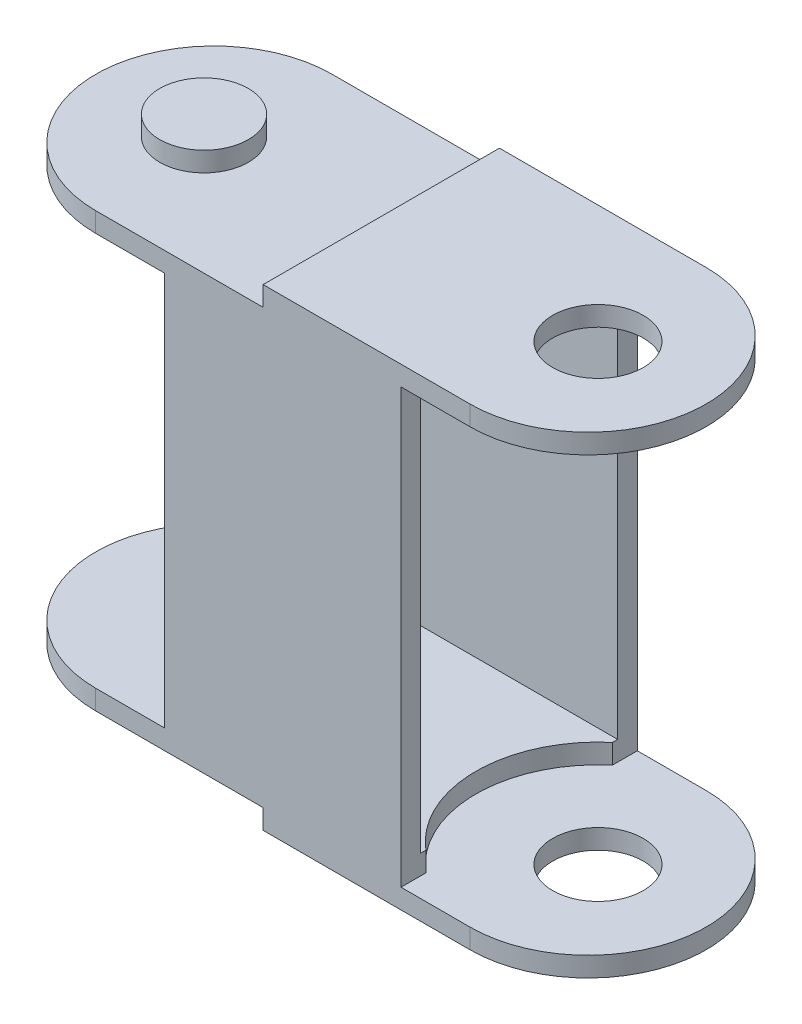
ISO-10303-21;
HEADER;
FILE_DESCRIPTION(('STEP AP214'),'2;1');
FILE_NAME('part.step','',(''),(''),'','','');
FILE_SCHEMA(('AUTOMOTIVE_DESIGN { 1 0 10303 214 1 1 1 1 }'));
ENDSEC;
DATA;
#1=APPLICATION_CONTEXT('core data for automotive mechanical design processes');
#2=APPLICATION_PROTOCOL_DEFINITION('international standard','automotive_design',2000,#1);
#3=PRODUCT_CONTEXT('',#1,'mechanical');
#4=PRODUCT('Part','Part','',(#3));
#5=PRODUCT_RELATED_PRODUCT_CATEGORY('part','',(#4));
#6=PRODUCT_DEFINITION_FORMATION('','',#4);
#7=PRODUCT_DEFINITION_CONTEXT('part definition',#1,'design');
#8=PRODUCT_DEFINITION('design','',#6,#7);
#9=PRODUCT_DEFINITION_SHAPE('','',#8);
#10=(LENGTH_UNIT() NAMED_UNIT(*) SI_UNIT(.MILLI.,.METRE.));
#11=(NAMED_UNIT(*) PLANE_ANGLE_UNIT() SI_UNIT($,.RADIAN.));
#12=(NAMED_UNIT(*) SI_UNIT($,.STERADIAN.) SOLID_ANGLE_UNIT());
#13=UNCERTAINTY_MEASURE_WITH_UNIT(LENGTH_MEASURE(1.E-05),#10,'distance_accuracy_value','');
#14=(GEOMETRIC_REPRESENTATION_CONTEXT(3) GLOBAL_UNCERTAINTY_ASSIGNED_CONTEXT((#13)) GLOBAL_UNIT_ASSIGNED_CONTEXT((#10,
#11,#12)) REPRESENTATION_CONTEXT('',''));
#15=CARTESIAN_POINT('',(0.,0.,0.));
#16=DIRECTION('',(0.,0.,1.));
#17=DIRECTION('',(1.,0.,0.));
#18=AXIS2_PLACEMENT_3D('',#15,#16,#17);
#19=CARTESIAN_POINT('',(-520.,21.5,0.));
#20=DIRECTION('',(0.,1.,0.));
#21=DIRECTION('',(-1.,0.,0.));
#22=AXIS2_PLACEMENT_3D('',#19,#20,#21);
#23=CYLINDRICAL_SURFACE('',#22,2.25);
#24=CARTESIAN_POINT('',(-520.,21.,0.));
#25=DIRECTION('',(0.,1.,0.));
#26=DIRECTION('',(-1.,0.,0.));
#27=AXIS2_PLACEMENT_3D('',#24,#25,#26);
#28=CIRCLE('',#27,2.25);
#29=CARTESIAN_POINT('',(-522.25,21.,0.));
#30=VERTEX_POINT('',#29);
#31=EDGE_CURVE('E205',#30,#30,#28,.F.);
#32=ORIENTED_EDGE('',*,*,#31,.F.);
#33=EDGE_LOOP('',(#32));
#34=FACE_BOUND('',#33,.T.);
#35=CARTESIAN_POINT('',(-520.,22.,0.));
#36=DIRECTION('',(0.,-1.,0.));
#37=DIRECTION('',(1.,0.,0.));
#38=AXIS2_PLACEMENT_3D('',#35,#36,#37);
#39=CIRCLE('',#38,2.25);
#40=CARTESIAN_POINT('',(-517.75,22.,0.));
#41=VERTEX_POINT('',#40);
#42=EDGE_CURVE('E202',#41,#41,#39,.F.);
#43=ORIENTED_EDGE('',*,*,#42,.F.);
#44=EDGE_LOOP('',(#43));
#45=FACE_BOUND('',#44,.T.);
#46=ADVANCED_FACE('F17',(#34,#45),#23,.T.);
#47=CARTESIAN_POINT('',(-511.,21.,6.));
#48=DIRECTION('',(0.,1.,0.));
#49=DIRECTION('',(0.,0.,-1.));
#50=AXIS2_PLACEMENT_3D('',#47,#48,#49);
#51=PLANE('',#50);
#52=CARTESIAN_POINT('',(-519.4999999999,21.,-1.E-10));
#53=DIRECTION('',(0.,1.,0.));
#54=DIRECTION('',(-1.,0.,1.6666E-11));
#55=AXIS2_PLACEMENT_3D('',#52,#53,#54);
#56=CIRCLE('',#55,6.);
#57=CARTESIAN_POINT('',(-519.499999999925,21.,5.9999999999));
#58=VERTEX_POINT('',#57);
#59=CARTESIAN_POINT('',(-519.499999999904,21.,-5.999999999986));
#60=VERTEX_POINT('',#59);
#61=EDGE_CURVE('E189',#58,#60,#56,.F.);
#62=ORIENTED_EDGE('',*,*,#61,.F.);
#63=DIRECTION('',(1.,0.,1.0458E-11));
#64=VECTOR('',#63,1.);
#65=CARTESIAN_POINT('',(-519.499999999925,21.,5.999999999911));
#66=LINE('',#65,#64);
#67=CARTESIAN_POINT('',(-511.,21.,6.));
#68=VERTEX_POINT('',#67);
#69=EDGE_CURVE('E177',#68,#58,#66,.F.);
#70=ORIENTED_EDGE('',*,*,#69,.F.);
#71=DIRECTION('',(0.,0.,-1.));
#72=VECTOR('',#71,1.);
#73=CARTESIAN_POINT('',(-511.,21.,6.));
#74=LINE('',#73,#72);
#75=CARTESIAN_POINT('',(-511.,21.,-6.));
#76=VERTEX_POINT('',#75);
#77=EDGE_CURVE('E188',#76,#68,#74,.F.);
#78=ORIENTED_EDGE('',*,*,#77,.F.);
#79=DIRECTION('',(-1.,0.,1.63E-12));
#80=VECTOR('',#79,1.);
#81=CARTESIAN_POINT('',(-511.,21.,-6.));
#82=LINE('',#81,#80);
#83=EDGE_CURVE('E201',#60,#76,#82,.F.);
#84=ORIENTED_EDGE('',*,*,#83,.F.);
#85=EDGE_LOOP('',(#62,#70,#78,#84));
#86=FACE_BOUND('',#85,.T.);
#87=ORIENTED_EDGE('',*,*,#31,.T.);
#88=EDGE_LOOP('',(#87));
#89=FACE_BOUND('',#88,.T.);
#90=ADVANCED_FACE('F199',(#86,#89),#51,.T.);
#91=CARTESIAN_POINT('',(-517.75,22.,-2.310200434237));
#92=DIRECTION('',(0.,1.,0.));
#93=DIRECTION('',(-1.,0.,0.));
#94=AXIS2_PLACEMENT_3D('',#91,#92,#93);
#95=PLANE('',#94);
#96=ORIENTED_EDGE('',*,*,#42,.T.);
#97=EDGE_LOOP('',(#96));
#98=FACE_BOUND('',#97,.T.);
#99=ADVANCED_FACE('F629',(#98),#95,.T.);
#100=CARTESIAN_POINT('',(-519.4999999999,-2.,1.E-10));
#101=DIRECTION('',(0.,1.,0.));
#102=DIRECTION('',(0.,0.,-1.));
#103=AXIS2_PLACEMENT_3D('',#100,#101,#102);
#104=CYLINDRICAL_SURFACE('',#103,6.);
#105=DIRECTION('',(-2.0691E-11,-1.,0.));
#106=VECTOR('',#105,1.);
#107=CARTESIAN_POINT('',(-519.499999999904,21.,-5.9999999999));
#108=LINE('',#107,#106);
#109=CARTESIAN_POINT('',(-519.499999999925,20.,-5.9999999999));
#110=VERTEX_POINT('',#109);
#111=EDGE_CURVE('E217',#110,#60,#108,.F.);
#112=ORIENTED_EDGE('',*,*,#111,.F.);
#113=CARTESIAN_POINT('',(-519.4999999999,20.,1.E-10));
#114=DIRECTION('',(0.,1.,0.));
#115=DIRECTION('',(-4.169E-12,0.,-1.));
#116=AXIS2_PLACEMENT_3D('',#113,#114,#115);
#117=CIRCLE('',#116,6.);
#118=CARTESIAN_POINT('',(-519.499999999909,20.,5.9999999999));
#119=VERTEX_POINT('',#118);
#120=EDGE_CURVE('E196',#110,#119,#117,.T.);
#121=ORIENTED_EDGE('',*,*,#120,.T.);
#122=DIRECTION('',(-1.5802E-11,1.,0.));
#123=VECTOR('',#122,1.);
#124=CARTESIAN_POINT('',(-519.499999999909,20.,5.9999999999));
#125=LINE('',#124,#123);
#126=EDGE_CURVE('E181',#119,#58,#125,.T.);
#127=ORIENTED_EDGE('',*,*,#126,.T.);
#128=ORIENTED_EDGE('',*,*,#61,.T.);
#129=EDGE_LOOP('',(#112,#121,#127,#128));
#130=FACE_BOUND('',#129,.T.);
#131=ADVANCED_FACE('F195',(#130),#104,.T.);
#132=CARTESIAN_POINT('',(-519.5,-2.,6.));
#133=DIRECTION('',(0.,0.,1.));
#134=DIRECTION('',(1.,0.,0.));
#135=AXIS2_PLACEMENT_3D('',#132,#133,#134);
#136=PLANE('',#135);
#137=DIRECTION('',(0.,-1.,0.));
#138=VECTOR('',#137,1.);
#139=CARTESIAN_POINT('',(-511.,22.,6.));
#140=LINE('',#139,#138);
#141=CARTESIAN_POINT('',(-511.,22.,6.));
#142=VERTEX_POINT('',#141);
#143=EDGE_CURVE('E184',#142,#68,#140,.T.);
#144=ORIENTED_EDGE('',*,*,#143,.T.);
#145=ORIENTED_EDGE('',*,*,#69,.T.);
#146=ORIENTED_EDGE('',*,*,#126,.F.);
#147=DIRECTION('',(1.,0.,0.));
#148=VECTOR('',#147,1.);
#149=CARTESIAN_POINT('',(-519.499999999909,20.,6.));
#150=LINE('',#149,#148);
#151=CARTESIAN_POINT('',(-516.,20.,6.));
#152=VERTEX_POINT('',#151);
#153=EDGE_CURVE('E229',#119,#152,#150,.T.);
#154=ORIENTED_EDGE('',*,*,#153,.T.);
#155=DIRECTION('',(0.,-1.,0.));
#156=VECTOR('',#155,1.);
#157=CARTESIAN_POINT('',(-516.,20.,6.));
#158=LINE('',#157,#156);
#159=CARTESIAN_POINT('',(-516.,0.,6.));
#160=VERTEX_POINT('',#159);
#161=EDGE_CURVE('E233',#152,#160,#158,.T.);
#162=ORIENTED_EDGE('',*,*,#161,.T.);
#163=DIRECTION('',(-1.,0.,0.));
#164=VECTOR('',#163,1.);
#165=CARTESIAN_POINT('',(-516.,0.,6.));
#166=LINE('',#165,#164);
#167=CARTESIAN_POINT('',(-519.499999999925,0.,6.));
#168=VERTEX_POINT('',#167);
#169=EDGE_CURVE('E238',#160,#168,#166,.T.);
#170=ORIENTED_EDGE('',*,*,#169,.T.);
#171=DIRECTION('',(-4.32E-12,-1.,0.));
#172=VECTOR('',#171,1.);
#173=CARTESIAN_POINT('',(-519.499999999925,0.,6.));
#174=LINE('',#173,#172);
#175=CARTESIAN_POINT('',(-519.499999999929,-1.,6.));
#176=VERTEX_POINT('',#175);
#177=EDGE_CURVE('E243',#176,#168,#174,.F.);
#178=ORIENTED_EDGE('',*,*,#177,.F.);
#179=DIRECTION('',(1.,0.,0.));
#180=VECTOR('',#179,1.);
#181=CARTESIAN_POINT('',(-519.499999999929,-1.,6.));
#182=LINE('',#181,#180);
#183=CARTESIAN_POINT('',(-511.,-1.,6.));
#184=VERTEX_POINT('',#183);
#185=EDGE_CURVE('E247',#176,#184,#182,.T.);
#186=ORIENTED_EDGE('',*,*,#185,.T.);
#187=DIRECTION('',(0.,-1.,0.));
#188=VECTOR('',#187,1.);
#189=CARTESIAN_POINT('',(-511.,-1.,6.));
#190=LINE('',#189,#188);
#191=CARTESIAN_POINT('',(-511.,-2.,6.));
#192=VERTEX_POINT('',#191);
#193=EDGE_CURVE('E252',#184,#192,#190,.T.);
#194=ORIENTED_EDGE('',*,*,#193,.T.);
#195=DIRECTION('',(1.,0.,0.));
#196=VECTOR('',#195,1.);
#197=CARTESIAN_POINT('',(-511.,-2.,6.));
#198=LINE('',#197,#196);
#199=CARTESIAN_POINT('',(-500.5,-2.,6.));
#200=VERTEX_POINT('',#199);
#201=EDGE_CURVE('E257',#192,#200,#198,.T.);
#202=ORIENTED_EDGE('',*,*,#201,.T.);
#203=DIRECTION('',(0.,1.,0.));
#204=VECTOR('',#203,1.);
#205=CARTESIAN_POINT('',(-500.5,-2.,6.));
#206=LINE('',#205,#204);
#207=CARTESIAN_POINT('',(-500.5,-1.,6.));
#208=VERTEX_POINT('',#207);
#209=EDGE_CURVE('E262',#200,#208,#206,.T.);
#210=ORIENTED_EDGE('',*,*,#209,.T.);
#211=DIRECTION('',(-1.,0.,0.));
#212=VECTOR('',#211,1.);
#213=CARTESIAN_POINT('',(-500.5,-1.,6.));
#214=LINE('',#213,#212);
#215=CARTESIAN_POINT('',(-504.,-1.,6.));
#216=VERTEX_POINT('',#215);
#217=EDGE_CURVE('E267',#208,#216,#214,.T.);
#218=ORIENTED_EDGE('',*,*,#217,.T.);
#219=DIRECTION('',(0.,1.,0.));
#220=VECTOR('',#219,1.);
#221=CARTESIAN_POINT('',(-504.,-1.,6.));
#222=LINE('',#221,#220);
#223=CARTESIAN_POINT('',(-504.,21.,6.));
#224=VERTEX_POINT('',#223);
#225=EDGE_CURVE('E272',#216,#224,#222,.T.);
#226=ORIENTED_EDGE('',*,*,#225,.T.);
#227=DIRECTION('',(1.,0.,0.));
#228=VECTOR('',#227,1.);
#229=CARTESIAN_POINT('',(-504.,21.,6.));
#230=LINE('',#229,#228);
#231=CARTESIAN_POINT('',(-500.5,21.,6.));
#232=VERTEX_POINT('',#231);
#233=EDGE_CURVE('E277',#224,#232,#230,.T.);
#234=ORIENTED_EDGE('',*,*,#233,.T.);
#235=DIRECTION('',(0.,1.,0.));
#236=VECTOR('',#235,1.);
#237=CARTESIAN_POINT('',(-500.5,21.,6.));
#238=LINE('',#237,#236);
#239=CARTESIAN_POINT('',(-500.5,22.,6.));
#240=VERTEX_POINT('',#239);
#241=EDGE_CURVE('E282',#232,#240,#238,.T.);
#242=ORIENTED_EDGE('',*,*,#241,.T.);
#243=DIRECTION('',(-1.,0.,0.));
#244=VECTOR('',#243,1.);
#245=CARTESIAN_POINT('',(-500.5,22.,6.));
#246=LINE('',#245,#244);
#247=EDGE_CURVE('E287',#240,#142,#246,.T.);
#248=ORIENTED_EDGE('',*,*,#247,.T.);
#249=EDGE_LOOP('',(#144,#145,#146,#154,#162,#170,#178,#186,#194,#202,#210,#218,#226,#234,#242,#248));
#250=FACE_BOUND('',#249,.T.);
#251=ADVANCED_FACE('F179',(#250),#136,.T.);
#252=CARTESIAN_POINT('',(-511.,21.,-6.));
#253=DIRECTION('',(-1.,0.,0.));
#254=DIRECTION('',(0.,0.,1.));
#255=AXIS2_PLACEMENT_3D('',#252,#253,#254);
#256=PLANE('',#255);
#257=DIRECTION('',(0.,0.,-1.));
#258=VECTOR('',#257,1.);
#259=CARTESIAN_POINT('',(-511.,22.,6.));
#260=LINE('',#259,#258);
#261=CARTESIAN_POINT('',(-511.,22.,-6.));
#262=VERTEX_POINT('',#261);
#263=EDGE_CURVE('E291',#262,#142,#260,.F.);
#264=ORIENTED_EDGE('',*,*,#263,.F.);
#265=DIRECTION('',(0.,-1.,0.));
#266=VECTOR('',#265,1.);
#267=CARTESIAN_POINT('',(-511.,22.,-6.));
#268=LINE('',#267,#266);
#269=EDGE_CURVE('E295',#76,#262,#268,.F.);
#270=ORIENTED_EDGE('',*,*,#269,.F.);
#271=ORIENTED_EDGE('',*,*,#77,.T.);
#272=ORIENTED_EDGE('',*,*,#143,.F.);
#273=EDGE_LOOP('',(#264,#270,#271,#272));
#274=FACE_BOUND('',#273,.T.);
#275=ADVANCED_FACE('F613',(#274),#256,.T.);
#276=CARTESIAN_POINT('',(-500.5,-2.,-6.));
#277=DIRECTION('',(0.,0.,-1.));
#278=DIRECTION('',(-1.,0.,0.));
#279=AXIS2_PLACEMENT_3D('',#276,#277,#278);
#280=PLANE('',#279);
#281=ORIENTED_EDGE('',*,*,#83,.T.);
#282=ORIENTED_EDGE('',*,*,#269,.T.);
#283=DIRECTION('',(1.,0.,0.));
#284=VECTOR('',#283,1.);
#285=CARTESIAN_POINT('',(-511.,22.,-6.));
#286=LINE('',#285,#284);
#287=CARTESIAN_POINT('',(-500.5,22.,-6.));
#288=VERTEX_POINT('',#287);
#289=EDGE_CURVE('E300',#262,#288,#286,.T.);
#290=ORIENTED_EDGE('',*,*,#289,.T.);
#291=DIRECTION('',(0.,-1.,0.));
#292=VECTOR('',#291,1.);
#293=CARTESIAN_POINT('',(-500.5,22.,-6.));
#294=LINE('',#293,#292);
#295=CARTESIAN_POINT('',(-500.5,21.,-6.));
#296=VERTEX_POINT('',#295);
#297=EDGE_CURVE('E305',#296,#288,#294,.F.);
#298=ORIENTED_EDGE('',*,*,#297,.F.);
#299=DIRECTION('',(-1.,0.,0.));
#300=VECTOR('',#299,1.);
#301=CARTESIAN_POINT('',(-500.5,21.,-6.));
#302=LINE('',#301,#300);
#303=CARTESIAN_POINT('',(-504.,21.,-6.));
#304=VERTEX_POINT('',#303);
#305=EDGE_CURVE('E310',#296,#304,#302,.T.);
#306=ORIENTED_EDGE('',*,*,#305,.T.);
#307=DIRECTION('',(0.,-1.,0.));
#308=VECTOR('',#307,1.);
#309=CARTESIAN_POINT('',(-504.,21.,-6.));
#310=LINE('',#309,#308);
#311=CARTESIAN_POINT('',(-504.,-1.,-6.));
#312=VERTEX_POINT('',#311);
#313=EDGE_CURVE('E315',#304,#312,#310,.T.);
#314=ORIENTED_EDGE('',*,*,#313,.T.);
#315=DIRECTION('',(1.,0.,0.));
#316=VECTOR('',#315,1.);
#317=CARTESIAN_POINT('',(-504.,-1.,-6.));
#318=LINE('',#317,#316);
#319=CARTESIAN_POINT('',(-500.5,-1.,-6.));
#320=VERTEX_POINT('',#319);
#321=EDGE_CURVE('E320',#312,#320,#318,.T.);
#322=ORIENTED_EDGE('',*,*,#321,.T.);
#323=DIRECTION('',(0.,-1.,0.));
#324=VECTOR('',#323,1.);
#325=CARTESIAN_POINT('',(-500.5,-1.,-6.));
#326=LINE('',#325,#324);
#327=CARTESIAN_POINT('',(-500.5,-2.,-6.));
#328=VERTEX_POINT('',#327);
#329=EDGE_CURVE('E325',#328,#320,#326,.F.);
#330=ORIENTED_EDGE('',*,*,#329,.F.);
#331=DIRECTION('',(-1.,0.,0.));
#332=VECTOR('',#331,1.);
#333=CARTESIAN_POINT('',(-500.5,-2.,-6.));
#334=LINE('',#333,#332);
#335=CARTESIAN_POINT('',(-511.,-2.,-6.));
#336=VERTEX_POINT('',#335);
#337=EDGE_CURVE('E330',#328,#336,#334,.T.);
#338=ORIENTED_EDGE('',*,*,#337,.T.);
#339=DIRECTION('',(0.,1.,0.));
#340=VECTOR('',#339,1.);
#341=CARTESIAN_POINT('',(-511.,-2.,-6.));
#342=LINE('',#341,#340);
#343=CARTESIAN_POINT('',(-511.,-1.,-6.));
#344=VERTEX_POINT('',#343);
#345=EDGE_CURVE('E335',#336,#344,#342,.T.);
#346=ORIENTED_EDGE('',*,*,#345,.T.);
#347=DIRECTION('',(-1.,0.,0.));
#348=VECTOR('',#347,1.);
#349=CARTESIAN_POINT('',(-511.,-1.,-6.));
#350=LINE('',#349,#348);
#351=CARTESIAN_POINT('',(-519.499999999904,-1.,-6.));
#352=VERTEX_POINT('',#351);
#353=EDGE_CURVE('E340',#344,#352,#350,.T.);
#354=ORIENTED_EDGE('',*,*,#353,.T.);
#355=DIRECTION('',(-4.889E-12,1.,0.));
#356=VECTOR('',#355,1.);
#357=CARTESIAN_POINT('',(-519.499999999904,-1.,-6.));
#358=LINE('',#357,#356);
#359=CARTESIAN_POINT('',(-519.499999999909,0.,-6.));
#360=VERTEX_POINT('',#359);
#361=EDGE_CURVE('E345',#352,#360,#358,.T.);
#362=ORIENTED_EDGE('',*,*,#361,.T.);
#363=DIRECTION('',(1.,0.,0.));
#364=VECTOR('',#363,1.);
#365=CARTESIAN_POINT('',(-519.499999999909,0.,-6.));
#366=LINE('',#365,#364);
#367=CARTESIAN_POINT('',(-516.,0.,-6.));
#368=VERTEX_POINT('',#367);
#369=EDGE_CURVE('E350',#360,#368,#366,.T.);
#370=ORIENTED_EDGE('',*,*,#369,.T.);
#371=DIRECTION('',(0.,1.,0.));
#372=VECTOR('',#371,1.);
#373=CARTESIAN_POINT('',(-516.,0.,-6.));
#374=LINE('',#373,#372);
#375=CARTESIAN_POINT('',(-516.,20.,-6.));
#376=VERTEX_POINT('',#375);
#377=EDGE_CURVE('E355',#368,#376,#374,.T.);
#378=ORIENTED_EDGE('',*,*,#377,.T.);
#379=DIRECTION('',(-1.,0.,0.));
#380=VECTOR('',#379,1.);
#381=CARTESIAN_POINT('',(-516.,20.,-6.));
#382=LINE('',#381,#380);
#383=EDGE_CURVE('E360',#376,#110,#382,.T.);
#384=ORIENTED_EDGE('',*,*,#383,.T.);
#385=ORIENTED_EDGE('',*,*,#111,.T.);
#386=EDGE_LOOP('',(#281,#282,#290,#298,#306,#314,#322,#330,#338,#346,#354,#362,#370,#378,#384,#385));
#387=FACE_BOUND('',#386,.T.);
#388=ADVANCED_FACE('F555',(#387),#280,.T.);
#389=CARTESIAN_POINT('',(-504.,20.,-6.));
#390=DIRECTION('',(0.,-1.,0.));
#391=DIRECTION('',(0.,0.,1.));
#392=AXIS2_PLACEMENT_3D('',#389,#390,#391);
#393=PLANE('',#392);
#394=CARTESIAN_POINT('',(-500.,20.,0.));
#395=DIRECTION('',(0.,1.,0.));
#396=DIRECTION('',(-1.,0.,0.));
#397=AXIS2_PLACEMENT_3D('',#394,#395,#396);
#398=CIRCLE('',#397,6.2);
#399=CARTESIAN_POINT('',(-504.,20.,-4.737087712931));
#400=VERTEX_POINT('',#399);
#401=CARTESIAN_POINT('',(-504.,20.,4.737087712931));
#402=VERTEX_POINT('',#401);
#403=EDGE_CURVE('E365',#400,#402,#398,.T.);
#404=ORIENTED_EDGE('',*,*,#403,.T.);
#405=DIRECTION('',(0.,0.,1.));
#406=VECTOR('',#405,1.);
#407=CARTESIAN_POINT('',(-504.,20.,4.737087712931));
#408=LINE('',#407,#406);
#409=CARTESIAN_POINT('',(-504.,20.,5.));
#410=VERTEX_POINT('',#409);
#411=EDGE_CURVE('E370',#402,#410,#408,.T.);
#412=ORIENTED_EDGE('',*,*,#411,.T.);
#413=DIRECTION('',(-1.,0.,0.));
#414=VECTOR('',#413,1.);
#415=CARTESIAN_POINT('',(-504.,20.,5.));
#416=LINE('',#415,#414);
#417=CARTESIAN_POINT('',(-516.,20.,5.));
#418=VERTEX_POINT('',#417);
#419=EDGE_CURVE('E375',#418,#410,#416,.F.);
#420=ORIENTED_EDGE('',*,*,#419,.F.);
#421=DIRECTION('',(0.,0.,1.));
#422=VECTOR('',#421,1.);
#423=CARTESIAN_POINT('',(-516.,20.,5.));
#424=LINE('',#423,#422);
#425=EDGE_CURVE('E379',#152,#418,#424,.F.);
#426=ORIENTED_EDGE('',*,*,#425,.F.);
#427=ORIENTED_EDGE('',*,*,#153,.F.);
#428=ORIENTED_EDGE('',*,*,#120,.F.);
#429=ORIENTED_EDGE('',*,*,#383,.F.);
#430=DIRECTION('',(0.,0.,1.));
#431=VECTOR('',#430,1.);
#432=CARTESIAN_POINT('',(-516.,20.,-6.));
#433=LINE('',#432,#431);
#434=CARTESIAN_POINT('',(-516.,20.,-5.));
#435=VERTEX_POINT('',#434);
#436=EDGE_CURVE('E384',#435,#376,#433,.F.);
#437=ORIENTED_EDGE('',*,*,#436,.F.);
#438=DIRECTION('',(1.,0.,0.));
#439=VECTOR('',#438,1.);
#440=CARTESIAN_POINT('',(-516.,20.,-5.));
#441=LINE('',#440,#439);
#442=CARTESIAN_POINT('',(-504.,20.,-5.));
#443=VERTEX_POINT('',#442);
#444=EDGE_CURVE('E388',#443,#435,#441,.F.);
#445=ORIENTED_EDGE('',*,*,#444,.F.);
#446=DIRECTION('',(0.,0.,1.));
#447=VECTOR('',#446,1.);
#448=CARTESIAN_POINT('',(-504.,20.,-5.));
#449=LINE('',#448,#447);
#450=EDGE_CURVE('E392',#443,#400,#449,.T.);
#451=ORIENTED_EDGE('',*,*,#450,.T.);
#452=EDGE_LOOP('',(#404,#412,#420,#426,#427,#428,#429,#437,#445,#451));
#453=FACE_BOUND('',#452,.T.);
#454=ADVANCED_FACE('F557',(#453),#393,.T.);
#455=CARTESIAN_POINT('',(-516.,20.,5.));
#456=DIRECTION('',(-1.,0.,0.));
#457=DIRECTION('',(0.,-1.,0.));
#458=AXIS2_PLACEMENT_3D('',#455,#456,#457);
#459=PLANE('',#458);
#460=DIRECTION('',(0.,-1.,0.));
#461=VECTOR('',#460,1.);
#462=CARTESIAN_POINT('',(-516.,20.,5.));
#463=LINE('',#462,#461);
#464=CARTESIAN_POINT('',(-516.,0.,5.));
#465=VERTEX_POINT('',#464);
#466=EDGE_CURVE('E397',#465,#418,#463,.F.);
#467=ORIENTED_EDGE('',*,*,#466,.F.);
#468=DIRECTION('',(0.,0.,1.));
#469=VECTOR('',#468,1.);
#470=CARTESIAN_POINT('',(-516.,0.,5.));
#471=LINE('',#470,#469);
#472=EDGE_CURVE('E401',#465,#160,#471,.T.);
#473=ORIENTED_EDGE('',*,*,#472,.T.);
#474=ORIENTED_EDGE('',*,*,#161,.F.);
#475=ORIENTED_EDGE('',*,*,#425,.T.);
#476=EDGE_LOOP('',(#467,#473,#474,#475));
#477=FACE_BOUND('',#476,.T.);
#478=ADVANCED_FACE('F563',(#477),#459,.T.);
#479=CARTESIAN_POINT('',(-504.,0.,-6.));
#480=DIRECTION('',(0.,1.,0.));
#481=DIRECTION('',(-1.,0.,0.));
#482=AXIS2_PLACEMENT_3D('',#479,#480,#481);
#483=PLANE('',#482);
#484=CARTESIAN_POINT('',(-500.,0.,0.));
#485=DIRECTION('',(0.,-1.,0.));
#486=DIRECTION('',(-1.,0.,0.));
#487=AXIS2_PLACEMENT_3D('',#484,#485,#486);
#488=CIRCLE('',#487,6.2);
#489=CARTESIAN_POINT('',(-504.,0.,4.737087712931));
#490=VERTEX_POINT('',#489);
#491=CARTESIAN_POINT('',(-504.,0.,-4.737087712931));
#492=VERTEX_POINT('',#491);
#493=EDGE_CURVE('E406',#490,#492,#488,.T.);
#494=ORIENTED_EDGE('',*,*,#493,.T.);
#495=DIRECTION('',(0.,0.,-1.));
#496=VECTOR('',#495,1.);
#497=CARTESIAN_POINT('',(-504.,0.,-4.737087712931));
#498=LINE('',#497,#496);
#499=CARTESIAN_POINT('',(-504.,0.,-5.));
#500=VERTEX_POINT('',#499);
#501=EDGE_CURVE('E411',#492,#500,#498,.T.);
#502=ORIENTED_EDGE('',*,*,#501,.T.);
#503=DIRECTION('',(-1.,0.,0.));
#504=VECTOR('',#503,1.);
#505=CARTESIAN_POINT('',(-504.,0.,-5.));
#506=LINE('',#505,#504);
#507=CARTESIAN_POINT('',(-516.,0.,-5.));
#508=VERTEX_POINT('',#507);
#509=EDGE_CURVE('E416',#508,#500,#506,.F.);
#510=ORIENTED_EDGE('',*,*,#509,.F.);
#511=DIRECTION('',(0.,0.,-1.));
#512=VECTOR('',#511,1.);
#513=CARTESIAN_POINT('',(-516.,0.,-5.));
#514=LINE('',#513,#512);
#515=EDGE_CURVE('E420',#368,#508,#514,.F.);
#516=ORIENTED_EDGE('',*,*,#515,.F.);
#517=ORIENTED_EDGE('',*,*,#369,.F.);
#518=CARTESIAN_POINT('',(-519.4999999999,0.,-1.E-10));
#519=DIRECTION('',(0.,1.,0.));
#520=DIRECTION('',(-1.,0.,1.6666E-11));
#521=AXIS2_PLACEMENT_3D('',#518,#519,#520);
#522=CIRCLE('',#521,6.);
#523=EDGE_CURVE('E425',#168,#360,#522,.F.);
#524=ORIENTED_EDGE('',*,*,#523,.F.);
#525=ORIENTED_EDGE('',*,*,#169,.F.);
#526=ORIENTED_EDGE('',*,*,#472,.F.);
#527=DIRECTION('',(1.,0.,0.));
#528=VECTOR('',#527,1.);
#529=CARTESIAN_POINT('',(-516.,0.,5.));
#530=LINE('',#529,#528);
#531=CARTESIAN_POINT('',(-504.,0.,5.));
#532=VERTEX_POINT('',#531);
#533=EDGE_CURVE('E429',#532,#465,#530,.F.);
#534=ORIENTED_EDGE('',*,*,#533,.F.);
#535=DIRECTION('',(0.,0.,-1.));
#536=VECTOR('',#535,1.);
#537=CARTESIAN_POINT('',(-504.,0.,5.));
#538=LINE('',#537,#536);
#539=EDGE_CURVE('E433',#532,#490,#538,.T.);
#540=ORIENTED_EDGE('',*,*,#539,.T.);
#541=EDGE_LOOP('',(#494,#502,#510,#516,#517,#524,#525,#526,#534,#540));
#542=FACE_BOUND('',#541,.T.);
#543=ADVANCED_FACE('F549',(#542),#483,.T.);
#544=CARTESIAN_POINT('',(-519.4999999999,-2.,-1.E-10));
#545=DIRECTION('',(0.,1.,0.));
#546=DIRECTION('',(-1.,0.,1.6666E-11));
#547=AXIS2_PLACEMENT_3D('',#544,#545,#546);
#548=CYLINDRICAL_SURFACE('',#547,6.);
#549=ORIENTED_EDGE('',*,*,#177,.T.);
#550=ORIENTED_EDGE('',*,*,#523,.T.);
#551=ORIENTED_EDGE('',*,*,#361,.F.);
#552=CARTESIAN_POINT('',(-519.4999999999,-1.,1.E-10));
#553=DIRECTION('',(0.,-1.,0.));
#554=DIRECTION('',(-1.,0.,-1.6668E-11));
#555=AXIS2_PLACEMENT_3D('',#552,#553,#554);
#556=CIRCLE('',#555,6.);
#557=EDGE_CURVE('E438',#352,#176,#556,.F.);
#558=ORIENTED_EDGE('',*,*,#557,.T.);
#559=EDGE_LOOP('',(#549,#550,#551,#558));
#560=FACE_BOUND('',#559,.T.);
#561=ADVANCED_FACE('F570',(#560),#548,.T.);
#562=CARTESIAN_POINT('',(-511.,-1.,-6.));
#563=DIRECTION('',(0.,-1.,0.));
#564=DIRECTION('',(0.,0.,1.));
#565=AXIS2_PLACEMENT_3D('',#562,#563,#564);
#566=PLANE('',#565);
#567=ORIENTED_EDGE('',*,*,#557,.F.);
#568=ORIENTED_EDGE('',*,*,#353,.F.);
#569=DIRECTION('',(0.,0.,1.));
#570=VECTOR('',#569,1.);
#571=CARTESIAN_POINT('',(-511.,-1.,-6.));
#572=LINE('',#571,#570);
#573=EDGE_CURVE('E443',#344,#184,#572,.T.);
#574=ORIENTED_EDGE('',*,*,#573,.T.);
#575=ORIENTED_EDGE('',*,*,#185,.F.);
#576=EDGE_LOOP('',(#567,#568,#574,#575));
#577=FACE_BOUND('',#576,.T.);
#578=CARTESIAN_POINT('',(-520.,-1.,0.));
#579=DIRECTION('',(0.,1.,0.));
#580=DIRECTION('',(-1.,0.,0.));
#581=AXIS2_PLACEMENT_3D('',#578,#579,#580);
#582=CIRCLE('',#581,2.25);
#583=CARTESIAN_POINT('',(-522.25,-1.,0.));
#584=VERTEX_POINT('',#583);
#585=EDGE_CURVE('E448',#584,#584,#582,.T.);
#586=ORIENTED_EDGE('',*,*,#585,.T.);
#587=EDGE_LOOP('',(#586));
#588=FACE_BOUND('',#587,.T.);
#589=ADVANCED_FACE('F574',(#577,#588),#566,.T.);
#590=CARTESIAN_POINT('',(-511.,-2.,-6.));
#591=DIRECTION('',(-1.,0.,0.));
#592=DIRECTION('',(0.,0.,1.));
#593=AXIS2_PLACEMENT_3D('',#590,#591,#592);
#594=PLANE('',#593);
#595=ORIENTED_EDGE('',*,*,#573,.F.);
#596=ORIENTED_EDGE('',*,*,#345,.F.);
#597=DIRECTION('',(0.,0.,1.));
#598=VECTOR('',#597,1.);
#599=CARTESIAN_POINT('',(-511.,-2.,-6.));
#600=LINE('',#599,#598);
#601=EDGE_CURVE('E453',#192,#336,#600,.F.);
#602=ORIENTED_EDGE('',*,*,#601,.F.);
#603=ORIENTED_EDGE('',*,*,#193,.F.);
#604=EDGE_LOOP('',(#595,#596,#602,#603));
#605=FACE_BOUND('',#604,.T.);
#606=ADVANCED_FACE('F578',(#605),#594,.T.);
#607=CARTESIAN_POINT('',(-494.5000000001,-2.,-6.));
#608=DIRECTION('',(0.,-1.,0.));
#609=DIRECTION('',(0.,0.,1.));
#610=AXIS2_PLACEMENT_3D('',#607,#608,#609);
#611=PLANE('',#610);
#612=ORIENTED_EDGE('',*,*,#601,.T.);
#613=ORIENTED_EDGE('',*,*,#337,.F.);
#614=CARTESIAN_POINT('',(-500.5000000001,-2.,-1.E-10));
#615=DIRECTION('',(0.,-1.,0.));
#616=DIRECTION('',(1.,0.,1.6668E-11));
#617=AXIS2_PLACEMENT_3D('',#614,#615,#616);
#618=CIRCLE('',#617,6.);
#619=EDGE_CURVE('E455',#200,#328,#618,.F.);
#620=ORIENTED_EDGE('',*,*,#619,.F.);
#621=ORIENTED_EDGE('',*,*,#201,.F.);
#622=EDGE_LOOP('',(#612,#613,#620,#621));
#623=FACE_BOUND('',#622,.T.);
#624=CARTESIAN_POINT('',(-500.,-2.,0.));
#625=DIRECTION('',(0.,1.,0.));
#626=DIRECTION('',(-1.,0.,0.));
#627=AXIS2_PLACEMENT_3D('',#624,#625,#626);
#628=CIRCLE('',#627,2.3);
#629=CARTESIAN_POINT('',(-502.3,-2.,0.));
#630=VERTEX_POINT('',#629);
#631=EDGE_CURVE('E459',#630,#630,#628,.T.);
#632=ORIENTED_EDGE('',*,*,#631,.T.);
#633=EDGE_LOOP('',(#632));
#634=FACE_BOUND('',#633,.T.);
#635=ADVANCED_FACE('F581',(#623,#634),#611,.T.);
#636=CARTESIAN_POINT('',(-500.5000000001,-2.,-1.E-10));
#637=DIRECTION('',(0.,1.,0.));
#638=DIRECTION('',(1.6661E-11,0.,1.));
#639=AXIS2_PLACEMENT_3D('',#636,#637,#638);
#640=CYLINDRICAL_SURFACE('',#639,6.);
#641=ORIENTED_EDGE('',*,*,#209,.F.);
#642=ORIENTED_EDGE('',*,*,#619,.T.);
#643=ORIENTED_EDGE('',*,*,#329,.T.);
#644=CARTESIAN_POINT('',(-500.5000000001,-1.,1.E-10));
#645=DIRECTION('',(0.,1.,0.));
#646=DIRECTION('',(1.,0.,-1.6667E-11));
#647=AXIS2_PLACEMENT_3D('',#644,#645,#646);
#648=CIRCLE('',#647,6.);
#649=EDGE_CURVE('E464',#320,#208,#648,.F.);
#650=ORIENTED_EDGE('',*,*,#649,.T.);
#651=EDGE_LOOP('',(#641,#642,#643,#650));
#652=FACE_BOUND('',#651,.T.);
#653=ADVANCED_FACE('F587',(#652),#640,.T.);
#654=CARTESIAN_POINT('',(-494.5000000001,-1.,-6.));
#655=DIRECTION('',(0.,1.,0.));
#656=DIRECTION('',(-1.,0.,0.));
#657=AXIS2_PLACEMENT_3D('',#654,#655,#656);
#658=PLANE('',#657);
#659=ORIENTED_EDGE('',*,*,#217,.F.);
#660=ORIENTED_EDGE('',*,*,#649,.F.);
#661=ORIENTED_EDGE('',*,*,#321,.F.);
#662=DIRECTION('',(0.,0.,1.));
#663=VECTOR('',#662,1.);
#664=CARTESIAN_POINT('',(-504.,-1.,-6.));
#665=LINE('',#664,#663);
#666=CARTESIAN_POINT('',(-504.,-1.,-4.737087712931));
#667=VERTEX_POINT('',#666);
#668=EDGE_CURVE('E467',#667,#312,#665,.F.);
#669=ORIENTED_EDGE('',*,*,#668,.F.);
#670=CARTESIAN_POINT('',(-500.,-1.,0.));
#671=DIRECTION('',(0.,1.,0.));
#672=DIRECTION('',(-1.,0.,0.));
#673=AXIS2_PLACEMENT_3D('',#670,#671,#672);
#674=CIRCLE('',#673,6.2);
#675=CARTESIAN_POINT('',(-504.,-1.,4.737087712931));
#676=VERTEX_POINT('',#675);
#677=EDGE_CURVE('E471',#676,#667,#674,.F.);
#678=ORIENTED_EDGE('',*,*,#677,.F.);
#679=DIRECTION('',(0.,0.,1.));
#680=VECTOR('',#679,1.);
#681=CARTESIAN_POINT('',(-504.,-1.,4.737087712931));
#682=LINE('',#681,#680);
#683=EDGE_CURVE('E475',#216,#676,#682,.F.);
#684=ORIENTED_EDGE('',*,*,#683,.F.);
#685=EDGE_LOOP('',(#659,#660,#661,#669,#678,#684));
#686=FACE_BOUND('',#685,.T.);
#687=CARTESIAN_POINT('',(-500.,-1.,0.));
#688=DIRECTION('',(0.,-1.,0.));
#689=DIRECTION('',(1.,0.,0.));
#690=AXIS2_PLACEMENT_3D('',#687,#688,#689);
#691=CIRCLE('',#690,2.3);
#692=CARTESIAN_POINT('',(-497.7,-1.,0.));
#693=VERTEX_POINT('',#692);
#694=EDGE_CURVE('E480',#693,#693,#691,.T.);
#695=ORIENTED_EDGE('',*,*,#694,.T.);
#696=EDGE_LOOP('',(#695));
#697=FACE_BOUND('',#696,.T.);
#698=ADVANCED_FACE('F590',(#686,#697),#658,.T.);
#699=CARTESIAN_POINT('',(-504.,-1.,4.737087712931));
#700=DIRECTION('',(1.,0.,0.));
#701=DIRECTION('',(0.,1.,0.));
#702=AXIS2_PLACEMENT_3D('',#699,#700,#701);
#703=PLANE('',#702);
#704=DIRECTION('',(0.,1.,0.));
#705=VECTOR('',#704,1.);
#706=CARTESIAN_POINT('',(-504.,20.,4.737087712931));
#707=LINE('',#706,#705);
#708=CARTESIAN_POINT('',(-504.,21.,4.737087712931));
#709=VERTEX_POINT('',#708);
#710=EDGE_CURVE('E485',#402,#709,#707,.T.);
#711=ORIENTED_EDGE('',*,*,#710,.T.);
#712=DIRECTION('',(0.,0.,1.));
#713=VECTOR('',#712,1.);
#714=CARTESIAN_POINT('',(-504.,21.,4.737087712931));
#715=LINE('',#714,#713);
#716=EDGE_CURVE('E487',#709,#224,#715,.T.);
#717=ORIENTED_EDGE('',*,*,#716,.T.);
#718=ORIENTED_EDGE('',*,*,#225,.F.);
#719=ORIENTED_EDGE('',*,*,#683,.T.);
#720=DIRECTION('',(0.,1.,0.));
#721=VECTOR('',#720,1.);
#722=CARTESIAN_POINT('',(-504.,-1.,4.737087712931));
#723=LINE('',#722,#721);
#724=EDGE_CURVE('E492',#676,#490,#723,.T.);
#725=ORIENTED_EDGE('',*,*,#724,.T.);
#726=ORIENTED_EDGE('',*,*,#539,.F.);
#727=DIRECTION('',(0.,1.,0.));
#728=VECTOR('',#727,1.);
#729=CARTESIAN_POINT('',(-504.,0.,5.));
#730=LINE('',#729,#728);
#731=EDGE_CURVE('E497',#410,#532,#730,.F.);
#732=ORIENTED_EDGE('',*,*,#731,.F.);
#733=ORIENTED_EDGE('',*,*,#411,.F.);
#734=EDGE_LOOP('',(#711,#717,#718,#719,#725,#726,#732,#733));
#735=FACE_BOUND('',#734,.T.);
#736=ADVANCED_FACE('F595',(#735),#703,.T.);
#737=CARTESIAN_POINT('',(-494.5000000001,21.,-6.));
#738=DIRECTION('',(0.,-1.,0.));
#739=DIRECTION('',(0.,0.,1.));
#740=AXIS2_PLACEMENT_3D('',#737,#738,#739);
#741=PLANE('',#740);
#742=ORIENTED_EDGE('',*,*,#305,.F.);
#743=CARTESIAN_POINT('',(-500.5000000001,21.,-1.E-10));
#744=DIRECTION('',(0.,-1.,0.));
#745=DIRECTION('',(1.,0.,1.6668E-11));
#746=AXIS2_PLACEMENT_3D('',#743,#744,#745);
#747=CIRCLE('',#746,6.);
#748=EDGE_CURVE('E501',#232,#296,#747,.F.);
#749=ORIENTED_EDGE('',*,*,#748,.F.);
#750=ORIENTED_EDGE('',*,*,#233,.F.);
#751=ORIENTED_EDGE('',*,*,#716,.F.);
#752=CARTESIAN_POINT('',(-500.,21.,0.));
#753=DIRECTION('',(0.,-1.,0.));
#754=DIRECTION('',(-1.,0.,0.));
#755=AXIS2_PLACEMENT_3D('',#752,#753,#754);
#756=CIRCLE('',#755,6.2);
#757=CARTESIAN_POINT('',(-504.,21.,-4.737087712931));
#758=VERTEX_POINT('',#757);
#759=EDGE_CURVE('E36',#758,#709,#756,.F.);
#760=ORIENTED_EDGE('',*,*,#759,.F.);
#761=DIRECTION('',(0.,0.,-1.));
#762=VECTOR('',#761,1.);
#763=CARTESIAN_POINT('',(-504.,21.,-4.737087712931));
#764=LINE('',#763,#762);
#765=EDGE_CURVE('E508',#304,#758,#764,.F.);
#766=ORIENTED_EDGE('',*,*,#765,.F.);
#767=EDGE_LOOP('',(#742,#749,#750,#751,#760,#766));
#768=FACE_BOUND('',#767,.T.);
#769=CARTESIAN_POINT('',(-500.,21.,0.));
#770=DIRECTION('',(0.,1.,0.));
#771=DIRECTION('',(1.,0.,0.));
#772=AXIS2_PLACEMENT_3D('',#769,#770,#771);
#773=CIRCLE('',#772,2.3);
#774=CARTESIAN_POINT('',(-497.7,21.,0.));
#775=VERTEX_POINT('',#774);
#776=EDGE_CURVE('E513',#775,#775,#773,.T.);
#777=ORIENTED_EDGE('',*,*,#776,.T.);
#778=EDGE_LOOP('',(#777));
#779=FACE_BOUND('',#778,.T.);
#780=ADVANCED_FACE('F600',(#768,#779),#741,.T.);
#781=CARTESIAN_POINT('',(-500.5000000001,-2.,-1.E-10));
#782=DIRECTION('',(0.,1.,0.));
#783=DIRECTION('',(1.6663E-11,0.,1.));
#784=AXIS2_PLACEMENT_3D('',#781,#782,#783);
#785=CYLINDRICAL_SURFACE('',#784,6.);
#786=ORIENTED_EDGE('',*,*,#748,.T.);
#787=ORIENTED_EDGE('',*,*,#297,.T.);
#788=CARTESIAN_POINT('',(-500.5000000001,22.,1.E-10));
#789=DIRECTION('',(0.,1.,0.));
#790=DIRECTION('',(1.,0.,-1.6667E-11));
#791=AXIS2_PLACEMENT_3D('',#788,#789,#790);
#792=CIRCLE('',#791,6.);
#793=EDGE_CURVE('E518',#288,#240,#792,.F.);
#794=ORIENTED_EDGE('',*,*,#793,.T.);
#795=ORIENTED_EDGE('',*,*,#241,.F.);
#796=EDGE_LOOP('',(#786,#787,#794,#795));
#797=FACE_BOUND('',#796,.T.);
#798=ADVANCED_FACE('F605',(#797),#785,.T.);
#799=CARTESIAN_POINT('',(-494.5000000001,22.,-6.));
#800=DIRECTION('',(0.,1.,0.));
#801=DIRECTION('',(-1.,0.,0.));
#802=AXIS2_PLACEMENT_3D('',#799,#800,#801);
#803=PLANE('',#802);
#804=ORIENTED_EDGE('',*,*,#263,.T.);
#805=ORIENTED_EDGE('',*,*,#247,.F.);
#806=ORIENTED_EDGE('',*,*,#793,.F.);
#807=ORIENTED_EDGE('',*,*,#289,.F.);
#808=EDGE_LOOP('',(#804,#805,#806,#807));
#809=FACE_BOUND('',#808,.T.);
#810=CARTESIAN_POINT('',(-500.,22.,0.));
#811=DIRECTION('',(0.,-1.,0.));
#812=DIRECTION('',(-1.,0.,0.));
#813=AXIS2_PLACEMENT_3D('',#810,#811,#812);
#814=CIRCLE('',#813,2.3);
#815=CARTESIAN_POINT('',(-502.3,22.,0.));
#816=VERTEX_POINT('',#815);
#817=EDGE_CURVE('E521',#816,#816,#814,.T.);
#818=ORIENTED_EDGE('',*,*,#817,.T.);
#819=EDGE_LOOP('',(#818));
#820=FACE_BOUND('',#819,.T.);
#821=ADVANCED_FACE('F608',(#809,#820),#803,.T.);
#822=CARTESIAN_POINT('',(-504.,-1.,-6.));
#823=DIRECTION('',(1.,0.,0.));
#824=DIRECTION('',(0.,1.,0.));
#825=AXIS2_PLACEMENT_3D('',#822,#823,#824);
#826=PLANE('',#825);
#827=DIRECTION('',(0.,-1.,0.));
#828=VECTOR('',#827,1.);
#829=CARTESIAN_POINT('',(-504.,21.,-4.737087712931));
#830=LINE('',#829,#828);
#831=EDGE_CURVE('E32',#758,#400,#830,.T.);
#832=ORIENTED_EDGE('',*,*,#831,.T.);
#833=ORIENTED_EDGE('',*,*,#450,.F.);
#834=DIRECTION('',(0.,-1.,0.));
#835=VECTOR('',#834,1.);
#836=CARTESIAN_POINT('',(-504.,20.,-5.));
#837=LINE('',#836,#835);
#838=EDGE_CURVE('E527',#500,#443,#837,.F.);
#839=ORIENTED_EDGE('',*,*,#838,.F.);
#840=ORIENTED_EDGE('',*,*,#501,.F.);
#841=DIRECTION('',(0.,-1.,0.));
#842=VECTOR('',#841,1.);
#843=CARTESIAN_POINT('',(-504.,0.,-4.737087712931));
#844=LINE('',#843,#842);
#845=EDGE_CURVE('E531',#492,#667,#844,.T.);
#846=ORIENTED_EDGE('',*,*,#845,.T.);
#847=ORIENTED_EDGE('',*,*,#668,.T.);
#848=ORIENTED_EDGE('',*,*,#313,.F.);
#849=ORIENTED_EDGE('',*,*,#765,.T.);
#850=EDGE_LOOP('',(#832,#833,#839,#840,#846,#847,#848,#849));
#851=FACE_BOUND('',#850,.T.);
#852=ADVANCED_FACE('F781',(#851),#826,.T.);
#853=CARTESIAN_POINT('',(-516.,20.,-6.));
#854=DIRECTION('',(-1.,0.,0.));
#855=DIRECTION('',(0.,-1.,0.));
#856=AXIS2_PLACEMENT_3D('',#853,#854,#855);
#857=PLANE('',#856);
#858=DIRECTION('',(0.,1.,0.));
#859=VECTOR('',#858,1.);
#860=CARTESIAN_POINT('',(-516.,0.,-5.));
#861=LINE('',#860,#859);
#862=EDGE_CURVE('E25',#435,#508,#861,.F.);
#863=ORIENTED_EDGE('',*,*,#862,.F.);
#864=ORIENTED_EDGE('',*,*,#436,.T.);
#865=ORIENTED_EDGE('',*,*,#377,.F.);
#866=ORIENTED_EDGE('',*,*,#515,.T.);
#867=EDGE_LOOP('',(#863,#864,#865,#866));
#868=FACE_BOUND('',#867,.T.);
#869=ADVANCED_FACE('F552',(#868),#857,.T.);
#870=CARTESIAN_POINT('',(-500.,20.5,0.));
#871=DIRECTION('',(0.,1.,0.));
#872=DIRECTION('',(-0.645161290322581,0.,-0.76404640531142));
#873=AXIS2_PLACEMENT_3D('',#870,#871,#872);
#874=CYLINDRICAL_SURFACE('',#873,6.2);
#875=ORIENTED_EDGE('',*,*,#831,.F.);
#876=ORIENTED_EDGE('',*,*,#759,.T.);
#877=ORIENTED_EDGE('',*,*,#710,.F.);
#878=ORIENTED_EDGE('',*,*,#403,.F.);
#879=EDGE_LOOP('',(#875,#876,#877,#878));
#880=FACE_BOUND('',#879,.T.);
#881=ADVANCED_FACE('F801',(#880),#874,.F.);
#882=CARTESIAN_POINT('',(-504.,20.,5.));
#883=DIRECTION('',(0.,0.,-1.));
#884=DIRECTION('',(0.,-1.,0.));
#885=AXIS2_PLACEMENT_3D('',#882,#883,#884);
#886=PLANE('',#885);
#887=ORIENTED_EDGE('',*,*,#731,.T.);
#888=ORIENTED_EDGE('',*,*,#533,.T.);
#889=ORIENTED_EDGE('',*,*,#466,.T.);
#890=ORIENTED_EDGE('',*,*,#419,.T.);
#891=EDGE_LOOP('',(#887,#888,#889,#890));
#892=FACE_BOUND('',#891,.T.);
#893=ADVANCED_FACE('F811',(#892),#886,.T.);
#894=CARTESIAN_POINT('',(-504.,0.,-5.));
#895=DIRECTION('',(0.,0.,1.));
#896=DIRECTION('',(0.,1.,0.));
#897=AXIS2_PLACEMENT_3D('',#894,#895,#896);
#898=PLANE('',#897);
#899=ORIENTED_EDGE('',*,*,#838,.T.);
#900=ORIENTED_EDGE('',*,*,#444,.T.);
#901=ORIENTED_EDGE('',*,*,#862,.T.);
#902=ORIENTED_EDGE('',*,*,#509,.T.);
#903=EDGE_LOOP('',(#899,#900,#901,#902));
#904=FACE_BOUND('',#903,.T.);
#905=ADVANCED_FACE('F542',(#904),#898,.T.);
#906=CARTESIAN_POINT('',(-500.,-0.5,0.));
#907=DIRECTION('',(0.,1.,0.));
#908=DIRECTION('',(-1.,0.,0.));
#909=AXIS2_PLACEMENT_3D('',#906,#907,#908);
#910=CYLINDRICAL_SURFACE('',#909,6.2);
#911=ORIENTED_EDGE('',*,*,#724,.F.);
#912=ORIENTED_EDGE('',*,*,#677,.T.);
#913=ORIENTED_EDGE('',*,*,#845,.F.);
#914=ORIENTED_EDGE('',*,*,#493,.F.);
#915=EDGE_LOOP('',(#911,#912,#913,#914));
#916=FACE_BOUND('',#915,.T.);
#917=ADVANCED_FACE('F831',(#916),#910,.F.);
#918=CARTESIAN_POINT('',(-520.,-1.5,0.));
#919=DIRECTION('',(0.,1.,0.));
#920=DIRECTION('',(-1.,0.,0.));
#921=AXIS2_PLACEMENT_3D('',#918,#919,#920);
#922=CYLINDRICAL_SURFACE('',#921,2.25);
#923=CARTESIAN_POINT('',(-520.,-2.,0.));
#924=DIRECTION('',(0.,1.,0.));
#925=DIRECTION('',(-1.,0.,0.));
#926=AXIS2_PLACEMENT_3D('',#923,#924,#925);
#927=CIRCLE('',#926,2.25);
#928=CARTESIAN_POINT('',(-522.25,-2.,0.));
#929=VERTEX_POINT('',#928);
#930=EDGE_CURVE('E11',#929,#929,#927,.F.);
#931=ORIENTED_EDGE('',*,*,#930,.F.);
#932=EDGE_LOOP('',(#931));
#933=FACE_BOUND('',#932,.T.);
#934=ORIENTED_EDGE('',*,*,#585,.F.);
#935=EDGE_LOOP('',(#934));
#936=FACE_BOUND('',#935,.T.);
#937=ADVANCED_FACE('F841',(#933,#936),#922,.T.);
#938=CARTESIAN_POINT('',(-500.,10.,0.));
#939=DIRECTION('',(0.,1.,0.));
#940=DIRECTION('',(-1.,0.,0.));
#941=AXIS2_PLACEMENT_3D('',#938,#939,#940);
#942=CYLINDRICAL_SURFACE('',#941,2.3);
#943=ORIENTED_EDGE('',*,*,#694,.F.);
#944=EDGE_LOOP('',(#943));
#945=FACE_BOUND('',#944,.T.);
#946=ORIENTED_EDGE('',*,*,#631,.F.);
#947=EDGE_LOOP('',(#946));
#948=FACE_BOUND('',#947,.T.);
#949=ADVANCED_FACE('F852',(#945,#948),#942,.F.);
#950=CARTESIAN_POINT('',(-500.,10.,0.));
#951=DIRECTION('',(0.,1.,0.));
#952=DIRECTION('',(1.,0.,0.));
#953=AXIS2_PLACEMENT_3D('',#950,#951,#952);
#954=CYLINDRICAL_SURFACE('',#953,2.3);
#955=ORIENTED_EDGE('',*,*,#776,.F.);
#956=EDGE_LOOP('',(#955));
#957=FACE_BOUND('',#956,.T.);
#958=ORIENTED_EDGE('',*,*,#817,.F.);
#959=EDGE_LOOP('',(#958));
#960=FACE_BOUND('',#959,.T.);
#961=ADVANCED_FACE('F863',(#957,#960),#954,.F.);
#962=CARTESIAN_POINT('',(-522.25,-2.,-2.310200434237));
#963=DIRECTION('',(0.,-1.,0.));
#964=DIRECTION('',(1.,0.,0.));
#965=AXIS2_PLACEMENT_3D('',#962,#963,#964);
#966=PLANE('',#965);
#967=ORIENTED_EDGE('',*,*,#930,.T.);
#968=EDGE_LOOP('',(#967));
#969=FACE_BOUND('',#968,.T.);
#970=ADVANCED_FACE('F19',(#969),#966,.T.);
#971=CLOSED_SHELL('',(#46,#90,#99,#131,#251,#275,#388,#454,#478,#543,#561,#589,#606,#635,#653,
#698,#736,#780,#798,#821,#852,#869,#881,#893,#905,#917,#937,#949,#961,#970));
#972=MANIFOLD_SOLID_BREP('B1',#971);
#973=ADVANCED_BREP_SHAPE_REPRESENTATION('',(#18,#972),#14);
#974=SHAPE_DEFINITION_REPRESENTATION(#9,#973);
ENDSEC;
END-ISO-10303-21;
